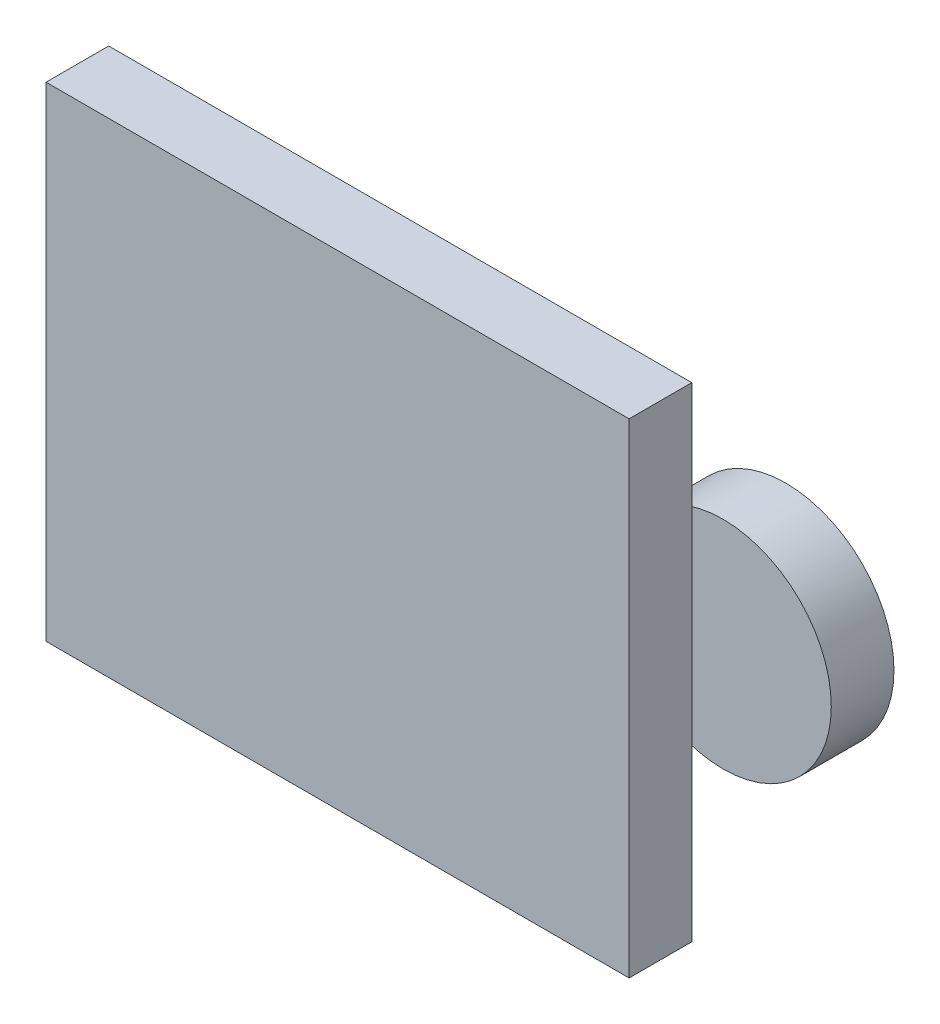
ISO-10303-21;
HEADER;
FILE_DESCRIPTION(('STEP AP214'),'2;1');
FILE_NAME('part.step','',(''),(''),'','','');
FILE_SCHEMA(('AUTOMOTIVE_DESIGN { 1 0 10303 214 1 1 1 1 }'));
ENDSEC;
DATA;
#1=APPLICATION_CONTEXT('core data for automotive mechanical design processes');
#2=APPLICATION_PROTOCOL_DEFINITION('international standard','automotive_design',2000,#1);
#3=PRODUCT_CONTEXT('',#1,'mechanical');
#4=PRODUCT('Part','Part','',(#3));
#5=PRODUCT_RELATED_PRODUCT_CATEGORY('part','',(#4));
#6=PRODUCT_DEFINITION_FORMATION('','',#4);
#7=PRODUCT_DEFINITION_CONTEXT('part definition',#1,'design');
#8=PRODUCT_DEFINITION('design','',#6,#7);
#9=PRODUCT_DEFINITION_SHAPE('','',#8);
#10=(LENGTH_UNIT() NAMED_UNIT(*) SI_UNIT(.MILLI.,.METRE.));
#11=(NAMED_UNIT(*) PLANE_ANGLE_UNIT() SI_UNIT($,.RADIAN.));
#12=(NAMED_UNIT(*) SI_UNIT($,.STERADIAN.) SOLID_ANGLE_UNIT());
#13=UNCERTAINTY_MEASURE_WITH_UNIT(LENGTH_MEASURE(1.E-05),#10,'distance_accuracy_value','');
#14=(GEOMETRIC_REPRESENTATION_CONTEXT(3) GLOBAL_UNCERTAINTY_ASSIGNED_CONTEXT((#13)) GLOBAL_UNIT_ASSIGNED_CONTEXT((#10,
#11,#12)) REPRESENTATION_CONTEXT('',''));
#15=CARTESIAN_POINT('',(0.,0.,0.));
#16=DIRECTION('',(0.,0.,1.));
#17=DIRECTION('',(1.,0.,0.));
#18=AXIS2_PLACEMENT_3D('',#15,#16,#17);
#19=CARTESIAN_POINT('',(44.0481916480239,-0.618220233656479,-15.));
#20=DIRECTION('',(0.,0.,1.));
#21=DIRECTION('',(1.,0.,0.));
#22=AXIS2_PLACEMENT_3D('',#19,#20,#21);
#23=CYLINDRICAL_SURFACE('',#22,17.2617733123611);
#24=CARTESIAN_POINT('',(44.0481916480239,-0.618220233656479,-15.));
#25=DIRECTION('',(0.,0.,1.));
#26=DIRECTION('',(1.,0.,0.));
#27=AXIS2_PLACEMENT_3D('',#24,#25,#26);
#28=CIRCLE('',#27,17.2617733123611);
#29=CARTESIAN_POINT('',(61.309964960385,-0.618220233656479,-15.));
#30=VERTEX_POINT('',#29);
#31=EDGE_CURVE('E11',#30,#30,#28,.T.);
#32=ORIENTED_EDGE('',*,*,#31,.T.);
#33=EDGE_LOOP('',(#32));
#34=FACE_BOUND('',#33,.T.);
#35=CARTESIAN_POINT('',(44.0481916480239,-0.618220233656479,-5.));
#36=DIRECTION('',(0.,0.,1.));
#37=DIRECTION('',(1.,0.,0.));
#38=AXIS2_PLACEMENT_3D('',#35,#36,#37);
#39=CIRCLE('',#38,17.2617733123611);
#40=CARTESIAN_POINT('',(61.309964960385,-0.618220233656479,-5.));
#41=VERTEX_POINT('',#40);
#42=EDGE_CURVE('E47',#41,#41,#39,.T.);
#43=ORIENTED_EDGE('',*,*,#42,.F.);
#44=EDGE_LOOP('',(#43));
#45=FACE_BOUND('',#44,.T.);
#46=ADVANCED_FACE('F44',(#34,#45),#23,.T.);
#47=CARTESIAN_POINT('',(44.0481916480239,-0.618220233656479,-15.));
#48=DIRECTION('',(0.,0.,1.));
#49=DIRECTION('',(1.,0.,0.));
#50=AXIS2_PLACEMENT_3D('',#47,#48,#49);
#51=PLANE('',#50);
#52=ORIENTED_EDGE('',*,*,#31,.F.);
#53=EDGE_LOOP('',(#52));
#54=FACE_BOUND('',#53,.T.);
#55=ADVANCED_FACE('F59',(#54),#51,.F.);
#56=CARTESIAN_POINT('',(44.0481916480239,-0.618220233656479,-5.));
#57=DIRECTION('',(0.,0.,1.));
#58=DIRECTION('',(1.,0.,0.));
#59=AXIS2_PLACEMENT_3D('',#56,#57,#58);
#60=PLANE('',#59);
#61=ORIENTED_EDGE('',*,*,#42,.T.);
#62=EDGE_LOOP('',(#61));
#63=FACE_BOUND('',#62,.T.);
#64=ADVANCED_FACE('F56',(#63),#60,.T.);
#65=CLOSED_SHELL('',(#46,#55,#64));
#66=MANIFOLD_SOLID_BREP('B2',#65);
#67=CARTESIAN_POINT('',(-48.9939535172757,38.0205443698732,10.));
#68=DIRECTION('',(1.,0.,0.));
#69=DIRECTION('',(0.,0.,-1.));
#70=AXIS2_PLACEMENT_3D('',#67,#68,#69);
#71=PLANE('',#70);
#72=DIRECTION('',(0.,-1.,0.));
#73=VECTOR('',#72,1.);
#74=CARTESIAN_POINT('',(-48.9939535172757,38.0205443698732,0.));
#75=LINE('',#74,#73);
#76=CARTESIAN_POINT('',(-48.9939535172757,38.0205443698732,0.));
#77=VERTEX_POINT('',#76);
#78=CARTESIAN_POINT('',(-48.9939535172757,-39.2569848371862,0.));
#79=VERTEX_POINT('',#78);
#80=EDGE_CURVE('E147',#77,#79,#75,.T.);
#81=ORIENTED_EDGE('',*,*,#80,.T.);
#82=DIRECTION('',(0.,0.,-1.));
#83=VECTOR('',#82,1.);
#84=CARTESIAN_POINT('',(-48.9939535172757,-39.2569848371862,10.));
#85=LINE('',#84,#83);
#86=CARTESIAN_POINT('',(-48.9939535172757,-39.2569848371862,10.));
#87=VERTEX_POINT('',#86);
#88=EDGE_CURVE('E42',#87,#79,#85,.T.);
#89=ORIENTED_EDGE('',*,*,#88,.F.);
#90=DIRECTION('',(0.,-1.,0.));
#91=VECTOR('',#90,1.);
#92=CARTESIAN_POINT('',(-48.9939535172757,38.0205443698732,10.));
#93=LINE('',#92,#91);
#94=CARTESIAN_POINT('',(-48.9939535172757,38.0205443698732,10.));
#95=VERTEX_POINT('',#94);
#96=EDGE_CURVE('E135',#95,#87,#93,.T.);
#97=ORIENTED_EDGE('',*,*,#96,.F.);
#98=DIRECTION('',(0.,0.,-1.));
#99=VECTOR('',#98,1.);
#100=CARTESIAN_POINT('',(-48.9939535172757,38.0205443698732,10.));
#101=LINE('',#100,#99);
#102=EDGE_CURVE('E143',#95,#77,#101,.T.);
#103=ORIENTED_EDGE('',*,*,#102,.T.);
#104=EDGE_LOOP('',(#81,#89,#97,#103));
#105=FACE_BOUND('',#104,.T.);
#106=ADVANCED_FACE('F84',(#105),#71,.F.);
#107=CARTESIAN_POINT('',(-48.9939535172757,-39.2569848371862,10.));
#108=DIRECTION('',(0.,1.,0.));
#109=DIRECTION('',(0.,0.,1.));
#110=AXIS2_PLACEMENT_3D('',#107,#108,#109);
#111=PLANE('',#110);
#112=DIRECTION('',(1.,0.,0.));
#113=VECTOR('',#112,1.);
#114=CARTESIAN_POINT('',(-48.9939535172757,-39.2569848371862,0.));
#115=LINE('',#114,#113);
#116=CARTESIAN_POINT('',(44.0481916480239,-39.2569848371862,0.));
#117=VERTEX_POINT('',#116);
#118=EDGE_CURVE('E139',#79,#117,#115,.T.);
#119=ORIENTED_EDGE('',*,*,#118,.T.);
#120=DIRECTION('',(0.,0.,-1.));
#121=VECTOR('',#120,1.);
#122=CARTESIAN_POINT('',(44.0481916480239,-39.2569848371862,10.));
#123=LINE('',#122,#121);
#124=CARTESIAN_POINT('',(44.0481916480239,-39.2569848371862,10.));
#125=VERTEX_POINT('',#124);
#126=EDGE_CURVE('E92',#125,#117,#123,.T.);
#127=ORIENTED_EDGE('',*,*,#126,.F.);
#128=DIRECTION('',(1.,0.,0.));
#129=VECTOR('',#128,1.);
#130=CARTESIAN_POINT('',(-48.9939535172757,-39.2569848371862,10.));
#131=LINE('',#130,#129);
#132=EDGE_CURVE('E130',#87,#125,#131,.T.);
#133=ORIENTED_EDGE('',*,*,#132,.F.);
#134=ORIENTED_EDGE('',*,*,#88,.T.);
#135=EDGE_LOOP('',(#119,#127,#133,#134));
#136=FACE_BOUND('',#135,.T.);
#137=ADVANCED_FACE('F138',(#136),#111,.F.);
#138=CARTESIAN_POINT('',(44.0481916480239,38.0205443698732,10.));
#139=DIRECTION('',(-1.,0.,0.));
#140=DIRECTION('',(0.,0.,1.));
#141=AXIS2_PLACEMENT_3D('',#138,#139,#140);
#142=PLANE('',#141);
#143=DIRECTION('',(0.,1.,0.));
#144=VECTOR('',#143,1.);
#145=CARTESIAN_POINT('',(44.0481916480239,38.0205443698732,0.));
#146=LINE('',#145,#144);
#147=CARTESIAN_POINT('',(44.0481916480239,38.0205443698732,0.));
#148=VERTEX_POINT('',#147);
#149=EDGE_CURVE('E117',#117,#148,#146,.T.);
#150=ORIENTED_EDGE('',*,*,#149,.T.);
#151=DIRECTION('',(0.,0.,-1.));
#152=VECTOR('',#151,1.);
#153=CARTESIAN_POINT('',(44.0481916480239,38.0205443698732,10.));
#154=LINE('',#153,#152);
#155=CARTESIAN_POINT('',(44.0481916480239,38.0205443698732,10.));
#156=VERTEX_POINT('',#155);
#157=EDGE_CURVE('E140',#156,#148,#154,.T.);
#158=ORIENTED_EDGE('',*,*,#157,.F.);
#159=DIRECTION('',(0.,1.,0.));
#160=VECTOR('',#159,1.);
#161=CARTESIAN_POINT('',(44.0481916480239,38.0205443698732,10.));
#162=LINE('',#161,#160);
#163=EDGE_CURVE('E133',#125,#156,#162,.T.);
#164=ORIENTED_EDGE('',*,*,#163,.F.);
#165=ORIENTED_EDGE('',*,*,#126,.T.);
#166=EDGE_LOOP('',(#150,#158,#164,#165));
#167=FACE_BOUND('',#166,.T.);
#168=ADVANCED_FACE('F141',(#167),#142,.F.);
#169=CARTESIAN_POINT('',(-48.9939535172757,38.0205443698732,10.));
#170=DIRECTION('',(0.,-1.,0.));
#171=DIRECTION('',(0.,0.,-1.));
#172=AXIS2_PLACEMENT_3D('',#169,#170,#171);
#173=PLANE('',#172);
#174=DIRECTION('',(-1.,0.,0.));
#175=VECTOR('',#174,1.);
#176=CARTESIAN_POINT('',(-48.9939535172757,38.0205443698732,0.));
#177=LINE('',#176,#175);
#178=EDGE_CURVE('E123',#148,#77,#177,.T.);
#179=ORIENTED_EDGE('',*,*,#178,.T.);
#180=ORIENTED_EDGE('',*,*,#102,.F.);
#181=DIRECTION('',(-1.,0.,0.));
#182=VECTOR('',#181,1.);
#183=CARTESIAN_POINT('',(-48.9939535172757,38.0205443698732,10.));
#184=LINE('',#183,#182);
#185=EDGE_CURVE('E100',#156,#95,#184,.T.);
#186=ORIENTED_EDGE('',*,*,#185,.F.);
#187=ORIENTED_EDGE('',*,*,#157,.T.);
#188=EDGE_LOOP('',(#179,#180,#186,#187));
#189=FACE_BOUND('',#188,.T.);
#190=ADVANCED_FACE('F154',(#189),#173,.F.);
#191=CARTESIAN_POINT('',(0.,0.,10.));
#192=DIRECTION('',(0.,0.,1.));
#193=DIRECTION('',(1.,0.,0.));
#194=AXIS2_PLACEMENT_3D('',#191,#192,#193);
#195=PLANE('',#194);
#196=ORIENTED_EDGE('',*,*,#96,.T.);
#197=ORIENTED_EDGE('',*,*,#132,.T.);
#198=ORIENTED_EDGE('',*,*,#163,.T.);
#199=ORIENTED_EDGE('',*,*,#185,.T.);
#200=EDGE_LOOP('',(#196,#197,#198,#199));
#201=FACE_BOUND('',#200,.T.);
#202=ADVANCED_FACE('F131',(#201),#195,.T.);
#203=CARTESIAN_POINT('',(0.,0.,0.));
#204=DIRECTION('',(0.,0.,1.));
#205=DIRECTION('',(1.,0.,0.));
#206=AXIS2_PLACEMENT_3D('',#203,#204,#205);
#207=PLANE('',#206);
#208=ORIENTED_EDGE('',*,*,#80,.F.);
#209=ORIENTED_EDGE('',*,*,#178,.F.);
#210=ORIENTED_EDGE('',*,*,#149,.F.);
#211=ORIENTED_EDGE('',*,*,#118,.F.);
#212=EDGE_LOOP('',(#208,#209,#210,#211));
#213=FACE_BOUND('',#212,.T.);
#214=ADVANCED_FACE('F157',(#213),#207,.F.);
#215=CLOSED_SHELL('',(#106,#137,#168,#190,#202,#214));
#216=MANIFOLD_SOLID_BREP('B6',#215);
#217=ADVANCED_BREP_SHAPE_REPRESENTATION('',(#18,#66,#216),#14);
#218=SHAPE_DEFINITION_REPRESENTATION(#9,#217);
ENDSEC;
END-ISO-10303-21;
